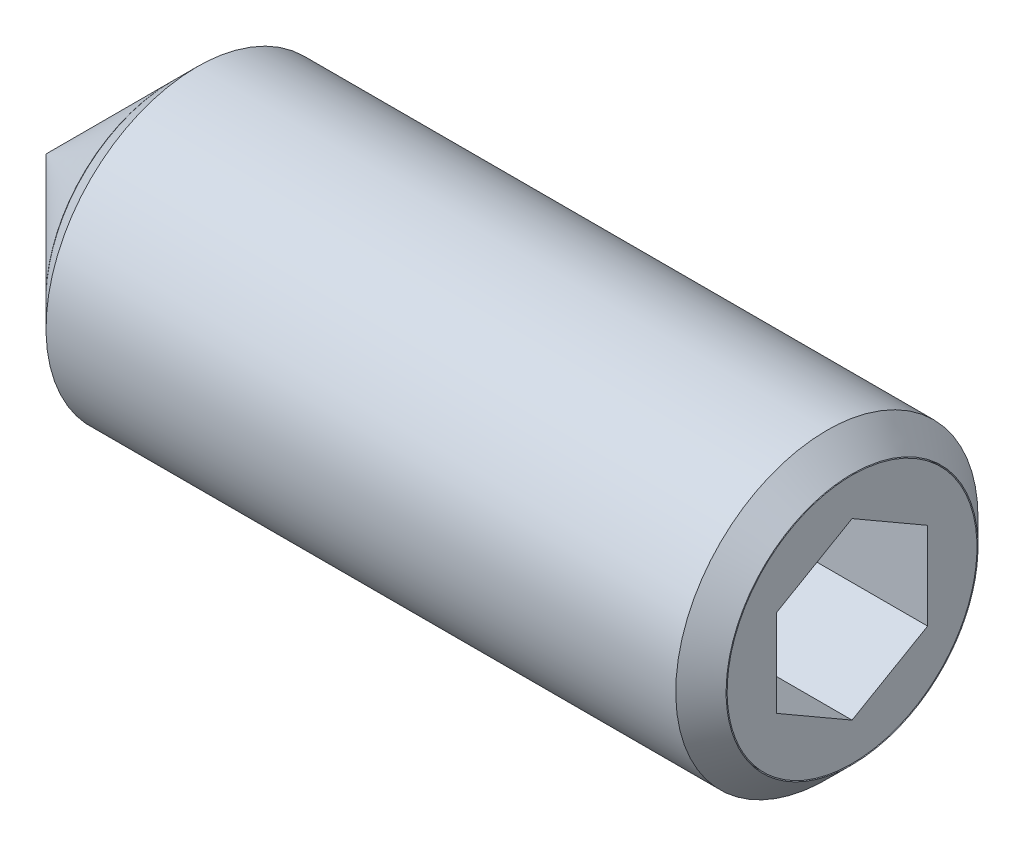
ISO-10303-21;
HEADER;
FILE_DESCRIPTION(('STEP AP214'),'2;1');
FILE_NAME('part.step','',(''),(''),'','','');
FILE_SCHEMA(('AUTOMOTIVE_DESIGN { 1 0 10303 214 1 1 1 1 }'));
ENDSEC;
DATA;
#1=APPLICATION_CONTEXT('core data for automotive mechanical design processes');
#2=APPLICATION_PROTOCOL_DEFINITION('international standard','automotive_design',2000,#1);
#3=PRODUCT_CONTEXT('',#1,'mechanical');
#4=PRODUCT('Part','Part','',(#3));
#5=PRODUCT_RELATED_PRODUCT_CATEGORY('part','',(#4));
#6=PRODUCT_DEFINITION_FORMATION('','',#4);
#7=PRODUCT_DEFINITION_CONTEXT('part definition',#1,'design');
#8=PRODUCT_DEFINITION('design','',#6,#7);
#9=PRODUCT_DEFINITION_SHAPE('','',#8);
#10=(LENGTH_UNIT() NAMED_UNIT(*) SI_UNIT(.MILLI.,.METRE.));
#11=(NAMED_UNIT(*) PLANE_ANGLE_UNIT() SI_UNIT($,.RADIAN.));
#12=(NAMED_UNIT(*) SI_UNIT($,.STERADIAN.) SOLID_ANGLE_UNIT());
#13=UNCERTAINTY_MEASURE_WITH_UNIT(LENGTH_MEASURE(1.E-05),#10,'distance_accuracy_value','');
#14=(GEOMETRIC_REPRESENTATION_CONTEXT(3) GLOBAL_UNCERTAINTY_ASSIGNED_CONTEXT((#13)) GLOBAL_UNIT_ASSIGNED_CONTEXT((#10,
#11,#12)) REPRESENTATION_CONTEXT('',''));
#15=CARTESIAN_POINT('',(0.,0.,0.));
#16=DIRECTION('',(0.,0.,1.));
#17=DIRECTION('',(1.,0.,0.));
#18=AXIS2_PLACEMENT_3D('',#15,#16,#17);
#19=CARTESIAN_POINT('',(22.947719387639,-7.76870930109512,-2.72800000001087));
#20=CARTESIAN_POINT('',(22.947719387639,-7.76870930109512,2.72800000001087));
#21=CARTESIAN_POINT('',(22.947719387639,-2.31270930107338,-2.72800000001087));
#22=CARTESIAN_POINT('',(22.947719387639,-2.31270930107338,2.72800000001087));
#23=(BOUNDED_SURFACE() B_SPLINE_SURFACE(1,1,((#19,#20),(#21,#22)),.UNSPECIFIED.,.F.,.F.,
.F.) B_SPLINE_SURFACE_WITH_KNOTS((2,2),(2,2),(0.,1.),(0.,1.),
.UNSPECIFIED.) GEOMETRIC_REPRESENTATION_ITEM() RATIONAL_B_SPLINE_SURFACE(((1.,1.),(1.,1.))) REPRESENTATION_ITEM('') SURFACE());
#24=CARTESIAN_POINT('',(22.947719387639,-3.30865849351534,0.));
#25=CARTESIAN_POINT('',(22.947719387639,-4.17468389729979,-1.50000000000004));
#26=(BOUNDED_CURVE() B_SPLINE_CURVE(1,(#24,#25),.UNSPECIFIED.,.F.,
.F.) B_SPLINE_CURVE_WITH_KNOTS((2,2),(0.,1.),
.UNSPECIFIED.) CURVE() GEOMETRIC_REPRESENTATION_ITEM() RATIONAL_B_SPLINE_CURVE((1.,1.)) REPRESENTATION_ITEM(''));
#27=CARTESIAN_POINT('',(22.947719387639,-3.30865849351538,0.));
#28=VERTEX_POINT('',#27);
#29=CARTESIAN_POINT('',(22.947719387639,-4.17468389729985,-1.5));
#30=VERTEX_POINT('',#29);
#31=EDGE_CURVE('P0_E100',#28,#30,#26,.T.);
#32=CARTESIAN_POINT('',(22.947719387639,-4.17468389729979,-1.50000000000004));
#33=CARTESIAN_POINT('',(22.947719387639,-5.90673470486864,-1.50000000000006));
#34=(BOUNDED_CURVE() B_SPLINE_CURVE(1,(#32,#33),.UNSPECIFIED.,.F.,
.F.) B_SPLINE_CURVE_WITH_KNOTS((2,2),(0.,1.),
.UNSPECIFIED.) CURVE() GEOMETRIC_REPRESENTATION_ITEM() RATIONAL_B_SPLINE_CURVE((1.,1.)) REPRESENTATION_ITEM(''));
#35=CARTESIAN_POINT('',(22.947719387639,-5.9067347048687,-1.5));
#36=VERTEX_POINT('',#35);
#37=EDGE_CURVE('P0_E388',#30,#36,#34,.T.);
#38=CARTESIAN_POINT('',(22.947719387639,-5.90673470486864,-1.50000000000006));
#39=CARTESIAN_POINT('',(22.947719387639,-6.77276010865311,0.));
#40=(BOUNDED_CURVE() B_SPLINE_CURVE(1,(#38,#39),.UNSPECIFIED.,.F.,
.F.) B_SPLINE_CURVE_WITH_KNOTS((2,2),(0.,1.),
.UNSPECIFIED.) CURVE() GEOMETRIC_REPRESENTATION_ITEM() RATIONAL_B_SPLINE_CURVE((1.,1.)) REPRESENTATION_ITEM(''));
#41=CARTESIAN_POINT('',(22.947719387639,-6.77276010865315,0.));
#42=VERTEX_POINT('',#41);
#43=EDGE_CURVE('P0_E412',#36,#42,#40,.T.);
#44=CARTESIAN_POINT('',(22.947719387639,-6.77276010865311,0.));
#45=CARTESIAN_POINT('',(22.947719387639,-5.90673470486868,1.5));
#46=(BOUNDED_CURVE() B_SPLINE_CURVE(1,(#44,#45),.UNSPECIFIED.,.F.,
.F.) B_SPLINE_CURVE_WITH_KNOTS((2,2),(0.,1.),
.UNSPECIFIED.) CURVE() GEOMETRIC_REPRESENTATION_ITEM() RATIONAL_B_SPLINE_CURVE((1.,1.)) REPRESENTATION_ITEM(''));
#47=CARTESIAN_POINT('',(22.947719387639,-5.90673470486872,1.50000000000003));
#48=VERTEX_POINT('',#47);
#49=EDGE_CURVE('P0_E426',#42,#48,#46,.T.);
#50=CARTESIAN_POINT('',(22.947719387639,-5.90673470486868,1.5));
#51=CARTESIAN_POINT('',(22.947719387639,-4.17468389729977,1.49999999999996));
#52=(BOUNDED_CURVE() B_SPLINE_CURVE(1,(#50,#51),.UNSPECIFIED.,.F.,
.F.) B_SPLINE_CURVE_WITH_KNOTS((2,2),(0.,1.),
.UNSPECIFIED.) CURVE() GEOMETRIC_REPRESENTATION_ITEM() RATIONAL_B_SPLINE_CURVE((1.,1.)) REPRESENTATION_ITEM(''));
#53=CARTESIAN_POINT('',(22.947719387639,-4.17468389729981,1.49999999999998));
#54=VERTEX_POINT('',#53);
#55=EDGE_CURVE('P0_E103',#48,#54,#52,.T.);
#56=CARTESIAN_POINT('',(22.947719387639,-4.17468389729977,1.49999999999996));
#57=CARTESIAN_POINT('',(22.947719387639,-3.30865849351534,0.));
#58=(BOUNDED_CURVE() B_SPLINE_CURVE(1,(#56,#57),.UNSPECIFIED.,.F.,
.F.) B_SPLINE_CURVE_WITH_KNOTS((2,2),(0.,1.),
.UNSPECIFIED.) CURVE() GEOMETRIC_REPRESENTATION_ITEM() RATIONAL_B_SPLINE_CURVE((1.,1.)) REPRESENTATION_ITEM(''));
#59=EDGE_CURVE('P0_E96',#54,#28,#58,.T.);
#60=CARTESIAN_POINT('',(22.947719387639,-2.56070930107437,0.));
#61=CARTESIAN_POINT('',(22.9477193876389,-2.56070930107437,-4.29548600278793));
#62=CARTESIAN_POINT('',(22.947719387639,-6.28070930108919,-2.14774300139397));
#63=CARTESIAN_POINT('',(22.9477193876389,-10.000709301104,0.));
#64=CARTESIAN_POINT('',(22.947719387639,-6.28070930108919,2.14774300139397));
#65=CARTESIAN_POINT('',(22.9477193876389,-2.56070930107436,4.29548600278793));
#66=CARTESIAN_POINT('',(22.947719387639,-2.56070930107437,0.));
#67=(BOUNDED_CURVE() B_SPLINE_CURVE(2,(#60,#61,#62,#63,#64,#65,#66),.UNSPECIFIED.,.T.,
.F.) B_SPLINE_CURVE_WITH_KNOTS((3,2,2,3),(0.,0.333333333333333,0.666666666666667,1.),
.UNSPECIFIED.) CURVE() GEOMETRIC_REPRESENTATION_ITEM() RATIONAL_B_SPLINE_CURVE((1.,0.5,1.,0.5,
1.,0.5,1.)) REPRESENTATION_ITEM(''));
#68=CARTESIAN_POINT('',(22.947719387639,-2.56070930107437,0.));
#69=VERTEX_POINT('',#68);
#70=EDGE_CURVE('P0_E11',#69,#69,#67,.T.);
#71=ORIENTED_EDGE('',*,*,#31,.T.);
#72=ORIENTED_EDGE('',*,*,#37,.T.);
#73=ORIENTED_EDGE('',*,*,#43,.T.);
#74=ORIENTED_EDGE('',*,*,#49,.T.);
#75=ORIENTED_EDGE('',*,*,#55,.T.);
#76=ORIENTED_EDGE('',*,*,#59,.T.);
#77=EDGE_LOOP('',(#71,#72,#73,#74,#75,#76));
#78=FACE_BOUND('',#77,.T.);
#79=ORIENTED_EDGE('',*,*,#70,.F.);
#80=EDGE_LOOP('',(#79));
#81=FACE_BOUND('',#80,.T.);
#82=ADVANCED_FACE('P0_F16',(#78,#81),#23,.T.);
#83=CARTESIAN_POINT('',(9.42771938764875,-2.56070930107437,0.));
#84=CARTESIAN_POINT('',(22.947719387639,-2.56070930107437,0.));
#85=CARTESIAN_POINT('',(9.42771938764876,-2.56070930107437,4.29548600278793));
#86=CARTESIAN_POINT('',(22.9477193876389,-2.56070930107436,4.29548600278793));
#87=CARTESIAN_POINT('',(9.42771938764875,-6.28070930108919,2.14774300139397));
#88=CARTESIAN_POINT('',(22.947719387639,-6.28070930108919,2.14774300139397));
#89=CARTESIAN_POINT('',(9.42771938764876,-10.000709301104,0.));
#90=CARTESIAN_POINT('',(22.9477193876389,-10.000709301104,0.));
#91=CARTESIAN_POINT('',(9.42771938764875,-6.28070930108919,-2.14774300139397));
#92=CARTESIAN_POINT('',(22.947719387639,-6.28070930108919,-2.14774300139397));
#93=CARTESIAN_POINT('',(9.42771938764876,-2.56070930107437,-4.29548600278793));
#94=CARTESIAN_POINT('',(22.9477193876389,-2.56070930107437,-4.29548600278793));
#95=CARTESIAN_POINT('',(9.42771938764875,-2.56070930107437,0.));
#96=CARTESIAN_POINT('',(22.947719387639,-2.56070930107437,0.));
#97=(BOUNDED_SURFACE() B_SPLINE_SURFACE(2,1,((#83,#84),(#85,#86),(#87,#88),(#89,#90),(#91,#92),
(#93,#94),(#95,#96)),.UNSPECIFIED.,.T.,.F.,.F.) B_SPLINE_SURFACE_WITH_KNOTS((3,2,2,3),(2,2),(0.,
0.333333333333333,0.666666666666667,1.),(0.,1.),
.UNSPECIFIED.) GEOMETRIC_REPRESENTATION_ITEM() RATIONAL_B_SPLINE_SURFACE(((1.,1.),(0.5,0.5),(1.,
1.),(0.5,0.5),(1.,1.),(0.5,0.5),(1.,1.))) REPRESENTATION_ITEM('') SURFACE());
#98=CARTESIAN_POINT('',(9.42771938764875,-2.56070930107437,0.));
#99=CARTESIAN_POINT('',(9.42771938764876,-2.56070930107437,4.29548600278793));
#100=CARTESIAN_POINT('',(9.42771938764875,-6.28070930108919,2.14774300139397));
#101=CARTESIAN_POINT('',(9.42771938764876,-10.000709301104,0.));
#102=CARTESIAN_POINT('',(9.42771938764875,-6.28070930108919,-2.14774300139397));
#103=CARTESIAN_POINT('',(9.42771938764876,-2.56070930107437,-4.29548600278793));
#104=CARTESIAN_POINT('',(9.42771938764875,-2.56070930107437,0.));
#105=(BOUNDED_CURVE() B_SPLINE_CURVE(2,(#98,#99,#100,#101,#102,#103,#104),.UNSPECIFIED.,.T.,
.F.) B_SPLINE_CURVE_WITH_KNOTS((3,2,2,3),(0.,0.333333333333333,0.666666666666667,1.),
.UNSPECIFIED.) CURVE() GEOMETRIC_REPRESENTATION_ITEM() RATIONAL_B_SPLINE_CURVE((1.,0.5,1.,0.5,
1.,0.5,1.)) REPRESENTATION_ITEM(''));
#106=CARTESIAN_POINT('',(9.42771938764875,-2.56070930107437,0.));
#107=VERTEX_POINT('',#106);
#108=EDGE_CURVE('P0_E161',#107,#107,#105,.T.);
#109=CARTESIAN_POINT('',(22.947719387639,-2.56070930107437,0.));
#110=CARTESIAN_POINT('',(9.42771938764875,-2.56070930107437,0.));
#111=(BOUNDED_CURVE() B_SPLINE_CURVE(1,(#109,#110),.UNSPECIFIED.,.F.,
.F.) B_SPLINE_CURVE_WITH_KNOTS((2,2),(0.,1.),
.UNSPECIFIED.) CURVE() GEOMETRIC_REPRESENTATION_ITEM() RATIONAL_B_SPLINE_CURVE((1.,1.)) REPRESENTATION_ITEM(''));
#112=EDGE_CURVE('P0_E29',#69,#107,#111,.T.);
#113=ORIENTED_EDGE('',*,*,#108,.T.);
#114=ORIENTED_EDGE('',*,*,#112,.F.);
#115=ORIENTED_EDGE('',*,*,#70,.T.);
#116=ORIENTED_EDGE('',*,*,#112,.T.);
#117=EDGE_LOOP('',(#113,#114,#115,#116));
#118=FACE_BOUND('',#117,.T.);
#119=ADVANCED_FACE('P0_F180',(#118),#97,.T.);
#120=CARTESIAN_POINT('',(6.94771938763892,-5.04070930108425,0.));
#121=CARTESIAN_POINT('',(9.42771938764875,-2.56070930107437,0.));
#122=CARTESIAN_POINT('',(6.94771938763892,-5.04070930108425,0.));
#123=CARTESIAN_POINT('',(9.42771938764876,-2.56070930107436,4.29548600278793));
#124=CARTESIAN_POINT('',(6.94771938763892,-5.04070930108425,0.));
#125=CARTESIAN_POINT('',(9.42771938764875,-6.28070930108919,2.14774300139397));
#126=CARTESIAN_POINT('',(6.94771938763892,-5.04070930108425,0.));
#127=CARTESIAN_POINT('',(9.42771938764876,-10.000709301104,0.));
#128=CARTESIAN_POINT('',(6.94771938763892,-5.04070930108425,0.));
#129=CARTESIAN_POINT('',(9.42771938764875,-6.28070930108919,-2.14774300139397));
#130=CARTESIAN_POINT('',(6.94771938763892,-5.04070930108425,0.));
#131=CARTESIAN_POINT('',(9.42771938764876,-2.56070930107437,-4.29548600278793));
#132=CARTESIAN_POINT('',(6.94771938763892,-5.04070930108425,0.));
#133=CARTESIAN_POINT('',(9.42771938764875,-2.56070930107437,0.));
#134=(BOUNDED_SURFACE() B_SPLINE_SURFACE(2,1,((#120,#121),(#122,#123),(#124,#125),(#126,#127),
(#128,#129),(#130,#131),(#132,#133)),.UNSPECIFIED.,.T.,.F.,.F.) B_SPLINE_SURFACE_WITH_KNOTS((3,
2,2,3),(2,2),(0.,0.333333333333333,0.666666666666667,1.),(0.,1.),
.UNSPECIFIED.) GEOMETRIC_REPRESENTATION_ITEM() RATIONAL_B_SPLINE_SURFACE(((1.,1.),(0.5,0.5),(1.,
1.),(0.5,0.5),(1.,1.),(0.5,0.5),(1.,1.))) REPRESENTATION_ITEM('') SURFACE());
#135=CARTESIAN_POINT('',(9.42771938764875,-2.56070930107437,0.));
#136=CARTESIAN_POINT('',(6.94771938763892,-5.04070930108425,0.));
#137=(BOUNDED_CURVE() B_SPLINE_CURVE(1,(#135,#136),.UNSPECIFIED.,.F.,
.F.) B_SPLINE_CURVE_WITH_KNOTS((2,2),(0.,1.),
.UNSPECIFIED.) CURVE() GEOMETRIC_REPRESENTATION_ITEM() RATIONAL_B_SPLINE_CURVE((1.,1.)) REPRESENTATION_ITEM(''));
#138=CARTESIAN_POINT('',(6.94771938763892,-5.04070930108425,0.));
#139=VERTEX_POINT('',#138);
#140=EDGE_CURVE('P0_E108',#107,#139,#137,.T.);
#141=ORIENTED_EDGE('',*,*,#140,.F.);
#142=ORIENTED_EDGE('',*,*,#108,.F.);
#143=ORIENTED_EDGE('',*,*,#140,.T.);
#144=EDGE_LOOP('',(#141,#142,#143));
#145=FACE_BOUND('',#144,.T.);
#146=ADVANCED_FACE('P0_F292',(#145),#134,.T.);
#147=CARTESIAN_POINT('',(22.947719387639,-4.17468389729981,1.49999999999998));
#148=CARTESIAN_POINT('',(18.3974080803244,-4.17468389729981,1.49999999999998));
#149=CARTESIAN_POINT('',(22.947719387639,-3.30865849351538,0.));
#150=CARTESIAN_POINT('',(18.3974080803244,-3.30865849351538,0.));
#151=(BOUNDED_SURFACE() B_SPLINE_SURFACE(1,1,((#147,#148),(#149,#150)),.UNSPECIFIED.,.F.,.F.,
.F.) B_SPLINE_SURFACE_WITH_KNOTS((2,2),(2,2),(0.,1.),(0.,1.),
.UNSPECIFIED.) GEOMETRIC_REPRESENTATION_ITEM() RATIONAL_B_SPLINE_SURFACE(((1.,1.),(1.,1.))) REPRESENTATION_ITEM('') SURFACE());
#152=CARTESIAN_POINT('',(22.947719387639,-3.30865849351534,0.));
#153=CARTESIAN_POINT('',(19.4477193876389,-3.30865849351534,0.));
#154=(BOUNDED_CURVE() B_SPLINE_CURVE(1,(#152,#153),.UNSPECIFIED.,.F.,
.F.) B_SPLINE_CURVE_WITH_KNOTS((2,2),(0.,0.769178142685269),
.UNSPECIFIED.) CURVE() GEOMETRIC_REPRESENTATION_ITEM() RATIONAL_B_SPLINE_CURVE((1.,1.)) REPRESENTATION_ITEM(''));
#155=CARTESIAN_POINT('',(19.4477193876389,-3.30865849351545,0.));
#156=VERTEX_POINT('',#155);
#157=EDGE_CURVE('P0_E112',#28,#156,#154,.T.);
#158=CARTESIAN_POINT('',(19.4477193876389,-4.17468389729977,1.49999999999996));
#159=CARTESIAN_POINT('',(22.947719387639,-4.17468389729977,1.49999999999996));
#160=(BOUNDED_CURVE() B_SPLINE_CURVE(1,(#158,#159),.UNSPECIFIED.,.F.,
.F.) B_SPLINE_CURVE_WITH_KNOTS((2,2),(0.230821857314735,1.),
.UNSPECIFIED.) CURVE() GEOMETRIC_REPRESENTATION_ITEM() RATIONAL_B_SPLINE_CURVE((1.,1.)) REPRESENTATION_ITEM(''));
#161=CARTESIAN_POINT('',(19.4477193876389,-4.17468389729981,1.49999999999999));
#162=VERTEX_POINT('',#161);
#163=EDGE_CURVE('P0_E442',#162,#54,#160,.T.);
#164=CARTESIAN_POINT('',(19.4477193876389,-3.30865849351541,1.301043E-13));
#165=CARTESIAN_POINT('',(19.1851415608104,-3.74167119540757,0.750000000000018));
#166=CARTESIAN_POINT('',(19.4477193876389,-4.17468389729973,1.4999999999999));
#167=(BOUNDED_CURVE() B_SPLINE_CURVE(2,(#164,#165,#166),.UNSPECIFIED.,.F.,
.F.) B_SPLINE_CURVE_WITH_KNOTS((3,3),(0.,1.),
.UNSPECIFIED.) CURVE() GEOMETRIC_REPRESENTATION_ITEM() RATIONAL_B_SPLINE_CURVE((1.,
1.15470053837919,1.)) REPRESENTATION_ITEM(''));
#168=EDGE_CURVE('P0_E109',#156,#162,#167,.T.);
#169=ORIENTED_EDGE('',*,*,#157,.F.);
#170=ORIENTED_EDGE('',*,*,#59,.F.);
#171=ORIENTED_EDGE('',*,*,#163,.F.);
#172=ORIENTED_EDGE('',*,*,#168,.F.);
#173=EDGE_LOOP('',(#169,#170,#171,#172));
#174=FACE_BOUND('',#173,.T.);
#175=ADVANCED_FACE('P0_F113',(#174),#151,.F.);
#176=CARTESIAN_POINT('',(18.3974080803244,-5.04070930108432,0.));
#177=CARTESIAN_POINT('',(19.4477193876389,-3.30865849351541,0.));
#178=CARTESIAN_POINT('',(18.3974080803244,-5.04070930108432,0.));
#179=CARTESIAN_POINT('',(19.4477193876389,-3.30865849351539,-3.00000000000005));
#180=CARTESIAN_POINT('',(18.3974080803244,-5.04070930108432,0.));
#181=CARTESIAN_POINT('',(19.447719387639,-5.90673470486873,-1.50000000000006));
#182=CARTESIAN_POINT('',(18.3974080803244,-5.04070930108432,0.));
#183=CARTESIAN_POINT('',(19.447719387639,-8.50481091622208,0.));
#184=CARTESIAN_POINT('',(18.3974080803244,-5.04070930108432,0.));
#185=CARTESIAN_POINT('',(19.447719387639,-5.90673470486875,1.49999999999997));
#186=CARTESIAN_POINT('',(18.3974080803244,-5.04070930108432,0.));
#187=CARTESIAN_POINT('',(19.4477193876389,-3.30865849351542,3.));
#188=CARTESIAN_POINT('',(18.3974080803244,-5.04070930108432,0.));
#189=CARTESIAN_POINT('',(19.4477193876389,-3.30865849351541,0.));
#190=(BOUNDED_SURFACE() B_SPLINE_SURFACE(2,1,((#176,#177),(#178,#179),(#180,#181),(#182,#183),
(#184,#185),(#186,#187),(#188,#189)),.UNSPECIFIED.,.T.,.F.,.F.) B_SPLINE_SURFACE_WITH_KNOTS((3,
2,2,3),(2,2),(0.,0.333333333333333,0.666666666666667,1.),(0.,1.),
.UNSPECIFIED.) GEOMETRIC_REPRESENTATION_ITEM() RATIONAL_B_SPLINE_SURFACE(((1.,1.),(0.5,0.5),(1.,
1.),(0.5,0.5),(1.,1.),(0.5,0.5),(1.,1.))) REPRESENTATION_ITEM('') SURFACE());
#191=CARTESIAN_POINT('',(19.4477193876389,-3.30865849351541,0.));
#192=CARTESIAN_POINT('',(18.3974080803244,-5.04070930108433,0.));
#193=(BOUNDED_CURVE() B_SPLINE_CURVE(1,(#191,#192),.UNSPECIFIED.,.F.,
.F.) B_SPLINE_CURVE_WITH_KNOTS((2,2),(0.,1.),
.UNSPECIFIED.) CURVE() GEOMETRIC_REPRESENTATION_ITEM() RATIONAL_B_SPLINE_CURVE((1.,1.)) REPRESENTATION_ITEM(''));
#194=CARTESIAN_POINT('',(18.3974080803244,-5.04070930108437,0.));
#195=VERTEX_POINT('',#194);
#196=EDGE_CURVE('P0_E146',#156,#195,#193,.T.);
#197=CARTESIAN_POINT('',(19.4477193876389,-4.17468389729984,1.49999999999996));
#198=CARTESIAN_POINT('',(19.1851415608104,-5.04070930108428,1.49999999999998));
#199=CARTESIAN_POINT('',(19.447719387639,-5.90673470486871,1.5));
#200=(BOUNDED_CURVE() B_SPLINE_CURVE(2,(#197,#198,#199),.UNSPECIFIED.,.F.,
.F.) B_SPLINE_CURVE_WITH_KNOTS((3,3),(0.,1.),
.UNSPECIFIED.) CURVE() GEOMETRIC_REPRESENTATION_ITEM() RATIONAL_B_SPLINE_CURVE((1.,
1.15470053837925,1.)) REPRESENTATION_ITEM(''));
#201=CARTESIAN_POINT('',(19.447719387639,-5.90673470486872,1.50000000000003));
#202=VERTEX_POINT('',#201);
#203=EDGE_CURVE('P0_E429',#162,#202,#200,.T.);
#204=CARTESIAN_POINT('',(19.447719387639,-5.90673470486866,1.5));
#205=CARTESIAN_POINT('',(19.1851415608103,-6.33974740676093,0.749999999999932));
#206=CARTESIAN_POINT('',(19.447719387639,-6.77276010865319,-1.543904E-13));
#207=(BOUNDED_CURVE() B_SPLINE_CURVE(2,(#204,#205,#206),.UNSPECIFIED.,.F.,
.F.) B_SPLINE_CURVE_WITH_KNOTS((3,3),(0.,1.),
.UNSPECIFIED.) CURVE() GEOMETRIC_REPRESENTATION_ITEM() RATIONAL_B_SPLINE_CURVE((1.,
1.1547005383793,1.)) REPRESENTATION_ITEM(''));
#208=CARTESIAN_POINT('',(19.447719387639,-6.77276010865315,0.));
#209=VERTEX_POINT('',#208);
#210=EDGE_CURVE('P0_E415',#202,#209,#207,.T.);
#211=CARTESIAN_POINT('',(19.447719387639,-6.77276010865319,1.387779E-13));
#212=CARTESIAN_POINT('',(19.1851415608102,-6.3397474067609,-0.749999999999997));
#213=CARTESIAN_POINT('',(19.4477193876389,-5.90673470486859,-1.50000000000014));
#214=(BOUNDED_CURVE() B_SPLINE_CURVE(2,(#211,#212,#213),.UNSPECIFIED.,.F.,
.F.) B_SPLINE_CURVE_WITH_KNOTS((3,3),(0.,1.),
.UNSPECIFIED.) CURVE() GEOMETRIC_REPRESENTATION_ITEM() RATIONAL_B_SPLINE_CURVE((1.,
1.15470053837932,1.)) REPRESENTATION_ITEM(''));
#215=CARTESIAN_POINT('',(19.447719387639,-5.9067347048687,-1.5));
#216=VERTEX_POINT('',#215);
#217=EDGE_CURVE('P0_E393',#209,#216,#214,.T.);
#218=CARTESIAN_POINT('',(19.447719387639,-5.90673470486874,-1.50000000000006));
#219=CARTESIAN_POINT('',(19.1851415608103,-5.0407093010843,-1.50000000000004));
#220=CARTESIAN_POINT('',(19.4477193876389,-4.17468389729984,-1.50000000000003));
#221=(BOUNDED_CURVE() B_SPLINE_CURVE(2,(#218,#219,#220),.UNSPECIFIED.,.F.,
.F.) B_SPLINE_CURVE_WITH_KNOTS((3,3),(0.,1.),
.UNSPECIFIED.) CURVE() GEOMETRIC_REPRESENTATION_ITEM() RATIONAL_B_SPLINE_CURVE((1.,
1.15470053837925,1.)) REPRESENTATION_ITEM(''));
#222=CARTESIAN_POINT('',(19.4477193876389,-4.17468389729985,-1.5));
#223=VERTEX_POINT('',#222);
#224=EDGE_CURVE('P0_E125',#216,#223,#221,.T.);
#225=CARTESIAN_POINT('',(19.4477193876389,-4.17468389729977,-1.5));
#226=CARTESIAN_POINT('',(19.1851415608103,-3.74167119540759,-0.750000000000068));
#227=CARTESIAN_POINT('',(19.4477193876389,-3.30865849351541,-1.387779E-13));
#228=(BOUNDED_CURVE() B_SPLINE_CURVE(2,(#225,#226,#227),.UNSPECIFIED.,.F.,
.F.) B_SPLINE_CURVE_WITH_KNOTS((3,3),(0.,1.),
.UNSPECIFIED.) CURVE() GEOMETRIC_REPRESENTATION_ITEM() RATIONAL_B_SPLINE_CURVE((1.,
1.15470053837921,1.)) REPRESENTATION_ITEM(''));
#229=EDGE_CURVE('P0_E118',#223,#156,#228,.T.);
#230=ORIENTED_EDGE('',*,*,#196,.T.);
#231=ORIENTED_EDGE('',*,*,#196,.F.);
#232=ORIENTED_EDGE('',*,*,#168,.T.);
#233=ORIENTED_EDGE('',*,*,#203,.T.);
#234=ORIENTED_EDGE('',*,*,#210,.T.);
#235=ORIENTED_EDGE('',*,*,#217,.T.);
#236=ORIENTED_EDGE('',*,*,#224,.T.);
#237=ORIENTED_EDGE('',*,*,#229,.T.);
#238=EDGE_LOOP('',(#230,#231,#232,#233,#234,#235,#236,#237));
#239=FACE_BOUND('',#238,.T.);
#240=ADVANCED_FACE('P0_F303',(#239),#190,.T.);
#241=CARTESIAN_POINT('',(22.947719387639,-3.30865849351538,0.));
#242=CARTESIAN_POINT('',(18.3974080803244,-3.30865849351538,0.));
#243=CARTESIAN_POINT('',(22.947719387639,-4.17468389729985,-1.5));
#244=CARTESIAN_POINT('',(18.3974080803244,-4.17468389729985,-1.5));
#245=(BOUNDED_SURFACE() B_SPLINE_SURFACE(1,1,((#241,#242),(#243,#244)),.UNSPECIFIED.,.F.,.F.,
.F.) B_SPLINE_SURFACE_WITH_KNOTS((2,2),(2,2),(0.,1.),(0.,1.),
.UNSPECIFIED.) GEOMETRIC_REPRESENTATION_ITEM() RATIONAL_B_SPLINE_SURFACE(((1.,1.),(1.,1.))) REPRESENTATION_ITEM('') SURFACE());
#246=CARTESIAN_POINT('',(19.4477193876389,-4.17468389729979,-1.50000000000004));
#247=CARTESIAN_POINT('',(22.947719387639,-4.17468389729979,-1.50000000000004));
#248=(BOUNDED_CURVE() B_SPLINE_CURVE(1,(#246,#247),.UNSPECIFIED.,.F.,
.F.) B_SPLINE_CURVE_WITH_KNOTS((2,2),(0.230821857314734,1.),
.UNSPECIFIED.) CURVE() GEOMETRIC_REPRESENTATION_ITEM() RATIONAL_B_SPLINE_CURVE((1.,1.)) REPRESENTATION_ITEM(''));
#249=EDGE_CURVE('P0_E122',#223,#30,#248,.T.);
#250=ORIENTED_EDGE('',*,*,#249,.T.);
#251=ORIENTED_EDGE('',*,*,#31,.F.);
#252=ORIENTED_EDGE('',*,*,#157,.T.);
#253=ORIENTED_EDGE('',*,*,#229,.F.);
#254=EDGE_LOOP('',(#250,#251,#252,#253));
#255=FACE_BOUND('',#254,.T.);
#256=ADVANCED_FACE('P0_F120',(#255),#245,.F.);
#257=CARTESIAN_POINT('',(22.947719387639,-4.17468389729985,-1.5));
#258=CARTESIAN_POINT('',(18.3974080803244,-4.17468389729985,-1.5));
#259=CARTESIAN_POINT('',(22.947719387639,-5.9067347048687,-1.5));
#260=CARTESIAN_POINT('',(18.3974080803244,-5.9067347048687,-1.5));
#261=(BOUNDED_SURFACE() B_SPLINE_SURFACE(1,1,((#257,#258),(#259,#260)),.UNSPECIFIED.,.F.,.F.,
.F.) B_SPLINE_SURFACE_WITH_KNOTS((2,2),(2,2),(0.,1.),(0.,1.),
.UNSPECIFIED.) GEOMETRIC_REPRESENTATION_ITEM() RATIONAL_B_SPLINE_SURFACE(((1.,1.),(1.,1.))) REPRESENTATION_ITEM('') SURFACE());
#262=CARTESIAN_POINT('',(19.447719387639,-5.90673470486864,-1.50000000000006));
#263=CARTESIAN_POINT('',(22.947719387639,-5.90673470486864,-1.50000000000006));
#264=(BOUNDED_CURVE() B_SPLINE_CURVE(1,(#262,#263),.UNSPECIFIED.,.F.,
.F.) B_SPLINE_CURVE_WITH_KNOTS((2,2),(0.230821857314741,1.),
.UNSPECIFIED.) CURVE() GEOMETRIC_REPRESENTATION_ITEM() RATIONAL_B_SPLINE_CURVE((1.,1.)) REPRESENTATION_ITEM(''));
#265=EDGE_CURVE('P0_E405',#216,#36,#264,.T.);
#266=ORIENTED_EDGE('',*,*,#265,.T.);
#267=ORIENTED_EDGE('',*,*,#37,.F.);
#268=ORIENTED_EDGE('',*,*,#249,.F.);
#269=ORIENTED_EDGE('',*,*,#224,.F.);
#270=EDGE_LOOP('',(#266,#267,#268,#269));
#271=FACE_BOUND('',#270,.T.);
#272=ADVANCED_FACE('P0_F316',(#271),#261,.F.);
#273=CARTESIAN_POINT('',(22.947719387639,-5.9067347048687,-1.5));
#274=CARTESIAN_POINT('',(18.3974080803244,-5.9067347048687,-1.5));
#275=CARTESIAN_POINT('',(22.947719387639,-6.77276010865315,0.));
#276=CARTESIAN_POINT('',(18.3974080803244,-6.77276010865315,0.));
#277=(BOUNDED_SURFACE() B_SPLINE_SURFACE(1,1,((#273,#274),(#275,#276)),.UNSPECIFIED.,.F.,.F.,
.F.) B_SPLINE_SURFACE_WITH_KNOTS((2,2),(2,2),(0.,1.),(0.,1.),
.UNSPECIFIED.) GEOMETRIC_REPRESENTATION_ITEM() RATIONAL_B_SPLINE_SURFACE(((1.,1.),(1.,1.))) REPRESENTATION_ITEM('') SURFACE());
#278=CARTESIAN_POINT('',(19.447719387639,-6.77276010865311,0.));
#279=CARTESIAN_POINT('',(22.947719387639,-6.77276010865311,0.));
#280=(BOUNDED_CURVE() B_SPLINE_CURVE(1,(#278,#279),.UNSPECIFIED.,.F.,
.F.) B_SPLINE_CURVE_WITH_KNOTS((2,2),(0.230821857314746,1.),
.UNSPECIFIED.) CURVE() GEOMETRIC_REPRESENTATION_ITEM() RATIONAL_B_SPLINE_CURVE((1.,1.)) REPRESENTATION_ITEM(''));
#281=EDGE_CURVE('P0_E422',#209,#42,#280,.T.);
#282=ORIENTED_EDGE('',*,*,#281,.T.);
#283=ORIENTED_EDGE('',*,*,#43,.F.);
#284=ORIENTED_EDGE('',*,*,#265,.F.);
#285=ORIENTED_EDGE('',*,*,#217,.F.);
#286=EDGE_LOOP('',(#282,#283,#284,#285));
#287=FACE_BOUND('',#286,.T.);
#288=ADVANCED_FACE('P0_F320',(#287),#277,.F.);
#289=CARTESIAN_POINT('',(22.947719387639,-6.77276010865315,0.));
#290=CARTESIAN_POINT('',(18.3974080803244,-6.77276010865315,0.));
#291=CARTESIAN_POINT('',(22.947719387639,-5.90673470486872,1.50000000000003));
#292=CARTESIAN_POINT('',(18.3974080803244,-5.90673470486872,1.50000000000003));
#293=(BOUNDED_SURFACE() B_SPLINE_SURFACE(1,1,((#289,#290),(#291,#292)),.UNSPECIFIED.,.F.,.F.,
.F.) B_SPLINE_SURFACE_WITH_KNOTS((2,2),(2,2),(0.,1.),(0.,1.),
.UNSPECIFIED.) GEOMETRIC_REPRESENTATION_ITEM() RATIONAL_B_SPLINE_SURFACE(((1.,1.),(1.,1.))) REPRESENTATION_ITEM('') SURFACE());
#294=CARTESIAN_POINT('',(19.447719387639,-5.90673470486868,1.5));
#295=CARTESIAN_POINT('',(22.947719387639,-5.90673470486868,1.5));
#296=(BOUNDED_CURVE() B_SPLINE_CURVE(1,(#294,#295),.UNSPECIFIED.,.F.,
.F.) B_SPLINE_CURVE_WITH_KNOTS((2,2),(0.230821857314743,1.),
.UNSPECIFIED.) CURVE() GEOMETRIC_REPRESENTATION_ITEM() RATIONAL_B_SPLINE_CURVE((1.,1.)) REPRESENTATION_ITEM(''));
#297=EDGE_CURVE('P0_E433',#202,#48,#296,.T.);
#298=ORIENTED_EDGE('',*,*,#297,.T.);
#299=ORIENTED_EDGE('',*,*,#49,.F.);
#300=ORIENTED_EDGE('',*,*,#281,.F.);
#301=ORIENTED_EDGE('',*,*,#210,.F.);
#302=EDGE_LOOP('',(#298,#299,#300,#301));
#303=FACE_BOUND('',#302,.T.);
#304=ADVANCED_FACE('P0_F329',(#303),#293,.F.);
#305=CARTESIAN_POINT('',(22.947719387639,-5.90673470486872,1.50000000000003));
#306=CARTESIAN_POINT('',(18.3974080803244,-5.90673470486872,1.50000000000003));
#307=CARTESIAN_POINT('',(22.947719387639,-4.17468389729981,1.49999999999998));
#308=CARTESIAN_POINT('',(18.3974080803244,-4.17468389729981,1.49999999999998));
#309=(BOUNDED_SURFACE() B_SPLINE_SURFACE(1,1,((#305,#306),(#307,#308)),.UNSPECIFIED.,.F.,.F.,
.F.) B_SPLINE_SURFACE_WITH_KNOTS((2,2),(2,2),(0.,1.),(0.,1.),
.UNSPECIFIED.) GEOMETRIC_REPRESENTATION_ITEM() RATIONAL_B_SPLINE_SURFACE(((1.,1.),(1.,1.))) REPRESENTATION_ITEM('') SURFACE());
#310=ORIENTED_EDGE('',*,*,#163,.T.);
#311=ORIENTED_EDGE('',*,*,#55,.F.);
#312=ORIENTED_EDGE('',*,*,#297,.F.);
#313=ORIENTED_EDGE('',*,*,#203,.F.);
#314=EDGE_LOOP('',(#310,#311,#312,#313));
#315=FACE_BOUND('',#314,.T.);
#316=ADVANCED_FACE('P0_F345',(#315),#309,.F.);
#317=CLOSED_SHELL('',(#82,#119,#146,#175,#240,#256,#272,#288,#304,#316));
#318=MANIFOLD_SOLID_BREP('P0_B1',#317);
#319=CARTESIAN_POINT('',(9.9477193876528,-2.0407093010703,0.));
#320=CARTESIAN_POINT('',(22.4477193876348,-2.04070930107023,0.));
#321=CARTESIAN_POINT('',(9.9477193876528,-2.0407093010703,5.19615242273078));
#322=CARTESIAN_POINT('',(22.4477193876348,-2.04070930107023,5.19615242273091));
#323=CARTESIAN_POINT('',(9.9477193876528,-6.54070930109122,2.59807621136539));
#324=CARTESIAN_POINT('',(22.4477193876348,-6.54070930109126,2.59807621136546));
#325=CARTESIAN_POINT('',(9.9477193876528,-11.0407093011121,0.));
#326=CARTESIAN_POINT('',(22.4477193876348,-11.0407093011123,0.));
#327=CARTESIAN_POINT('',(9.9477193876528,-6.54070930109122,-2.59807621136539));
#328=CARTESIAN_POINT('',(22.4477193876348,-6.54070930109126,-2.59807621136546));
#329=CARTESIAN_POINT('',(9.9477193876528,-2.04070930107031,-5.19615242273078));
#330=CARTESIAN_POINT('',(22.4477193876348,-2.04070930107023,-5.19615242273092));
#331=CARTESIAN_POINT('',(9.9477193876528,-2.0407093010703,0.));
#332=CARTESIAN_POINT('',(22.4477193876348,-2.04070930107023,0.));
#333=(BOUNDED_SURFACE() B_SPLINE_SURFACE(2,1,((#319,#320),(#321,#322),(#323,#324),(#325,#326),
(#327,#328),(#329,#330),(#331,#332)),.UNSPECIFIED.,.T.,.F.,.F.) B_SPLINE_SURFACE_WITH_KNOTS((3,
2,2,3),(2,2),(0.,0.333333333333333,0.666666666666667,1.),(0.,1.),
.UNSPECIFIED.) GEOMETRIC_REPRESENTATION_ITEM() RATIONAL_B_SPLINE_SURFACE(((1.,1.),(0.5,0.5),(1.,
1.),(0.5,0.5),(1.,1.),(0.5,0.5),(1.,1.))) REPRESENTATION_ITEM('') SURFACE());
#334=CARTESIAN_POINT('',(9.9477193876528,-2.0407093010703,0.));
#335=CARTESIAN_POINT('',(9.9477193876528,-2.0407093010703,5.19615242273078));
#336=CARTESIAN_POINT('',(9.9477193876528,-6.54070930109122,2.59807621136539));
#337=CARTESIAN_POINT('',(9.9477193876528,-11.0407093011121,0.));
#338=CARTESIAN_POINT('',(9.9477193876528,-6.54070930109122,-2.59807621136539));
#339=CARTESIAN_POINT('',(9.9477193876528,-2.04070930107031,-5.19615242273078));
#340=CARTESIAN_POINT('',(9.9477193876528,-2.0407093010703,0.));
#341=(BOUNDED_CURVE() B_SPLINE_CURVE(2,(#334,#335,#336,#337,#338,#339,#340),.UNSPECIFIED.,.T.,
.F.) B_SPLINE_CURVE_WITH_KNOTS((3,2,2,3),(0.,0.333333333333333,0.666666666666667,1.),
.UNSPECIFIED.) CURVE() GEOMETRIC_REPRESENTATION_ITEM() RATIONAL_B_SPLINE_CURVE((1.,0.5,1.,0.5,
1.,0.5,1.)) REPRESENTATION_ITEM(''));
#342=CARTESIAN_POINT('',(9.9477193876528,-2.0407093010703,0.));
#343=VERTEX_POINT('',#342);
#344=EDGE_CURVE('P1_E28',#343,#343,#341,.T.);
#345=CARTESIAN_POINT('',(22.4477193876348,-2.04070930107023,0.));
#346=CARTESIAN_POINT('',(9.9477193876528,-2.0407093010703,0.));
#347=(BOUNDED_CURVE() B_SPLINE_CURVE(1,(#345,#346),.UNSPECIFIED.,.F.,
.F.) B_SPLINE_CURVE_WITH_KNOTS((2,2),(0.,1.),
.UNSPECIFIED.) CURVE() GEOMETRIC_REPRESENTATION_ITEM() RATIONAL_B_SPLINE_CURVE((1.,1.)) REPRESENTATION_ITEM(''));
#348=CARTESIAN_POINT('',(22.4477193876348,-2.04070930107023,0.));
#349=VERTEX_POINT('',#348);
#350=EDGE_CURVE('P1_E11',#349,#343,#347,.T.);
#351=CARTESIAN_POINT('',(22.4477193876348,-2.04070930107023,0.));
#352=CARTESIAN_POINT('',(22.4477193876348,-2.04070930107023,5.19615242273091));
#353=CARTESIAN_POINT('',(22.4477193876348,-6.54070930109126,2.59807621136546));
#354=CARTESIAN_POINT('',(22.4477193876348,-11.0407093011123,0.));
#355=CARTESIAN_POINT('',(22.4477193876348,-6.54070930109126,-2.59807621136546));
#356=CARTESIAN_POINT('',(22.4477193876348,-2.04070930107023,-5.19615242273092));
#357=CARTESIAN_POINT('',(22.4477193876348,-2.04070930107023,0.));
#358=(BOUNDED_CURVE() B_SPLINE_CURVE(2,(#351,#352,#353,#354,#355,#356,#357),.UNSPECIFIED.,.T.,
.F.) B_SPLINE_CURVE_WITH_KNOTS((3,2,2,3),(0.,0.333333333333333,0.666666666666667,1.),
.UNSPECIFIED.) CURVE() GEOMETRIC_REPRESENTATION_ITEM() RATIONAL_B_SPLINE_CURVE((1.,0.5,1.,0.5,
1.,0.5,1.)) REPRESENTATION_ITEM(''));
#359=EDGE_CURVE('P1_E60',#349,#349,#358,.T.);
#360=ORIENTED_EDGE('',*,*,#344,.T.);
#361=ORIENTED_EDGE('',*,*,#350,.F.);
#362=ORIENTED_EDGE('',*,*,#359,.F.);
#363=ORIENTED_EDGE('',*,*,#350,.T.);
#364=EDGE_LOOP('',(#360,#361,#362,#363));
#365=FACE_BOUND('',#364,.T.);
#366=ADVANCED_FACE('P1_F16',(#365),#333,.T.);
#367=CARTESIAN_POINT('',(9.44771938764881,-2.54070930107431,0.));
#368=CARTESIAN_POINT('',(9.9477193876528,-2.0407093010703,0.));
#369=CARTESIAN_POINT('',(9.44771938764882,-2.5407093010743,4.33012701893942));
#370=CARTESIAN_POINT('',(9.9477193876528,-2.0407093010703,5.19615242273078));
#371=CARTESIAN_POINT('',(9.44771938764881,-6.29070930108922,2.16506350946971));
#372=CARTESIAN_POINT('',(9.9477193876528,-6.54070930109122,2.59807621136539));
#373=CARTESIAN_POINT('',(9.44771938764882,-10.0407093011041,0.));
#374=CARTESIAN_POINT('',(9.9477193876528,-11.0407093011121,0.));
#375=CARTESIAN_POINT('',(9.44771938764881,-6.29070930108922,-2.16506350946971));
#376=CARTESIAN_POINT('',(9.9477193876528,-6.54070930109122,-2.59807621136539));
#377=CARTESIAN_POINT('',(9.44771938764882,-2.54070930107431,-4.33012701893942));
#378=CARTESIAN_POINT('',(9.9477193876528,-2.04070930107031,-5.19615242273078));
#379=CARTESIAN_POINT('',(9.44771938764881,-2.54070930107431,0.));
#380=CARTESIAN_POINT('',(9.9477193876528,-2.0407093010703,0.));
#381=(BOUNDED_SURFACE() B_SPLINE_SURFACE(2,1,((#367,#368),(#369,#370),(#371,#372),(#373,#374),
(#375,#376),(#377,#378),(#379,#380)),.UNSPECIFIED.,.T.,.F.,.F.) B_SPLINE_SURFACE_WITH_KNOTS((3,
2,2,3),(2,2),(0.,0.333333333333333,0.666666666666667,1.),(0.,1.),
.UNSPECIFIED.) GEOMETRIC_REPRESENTATION_ITEM() RATIONAL_B_SPLINE_SURFACE(((1.,1.),(0.5,0.5),(1.,
1.),(0.5,0.5),(1.,1.),(0.5,0.5),(1.,1.))) REPRESENTATION_ITEM('') SURFACE());
#382=CARTESIAN_POINT('',(9.44771938764881,-2.54070930107431,0.));
#383=CARTESIAN_POINT('',(9.44771938764882,-2.5407093010743,4.33012701893942));
#384=CARTESIAN_POINT('',(9.44771938764881,-6.29070930108922,2.16506350946971));
#385=CARTESIAN_POINT('',(9.44771938764882,-10.0407093011041,0.));
#386=CARTESIAN_POINT('',(9.44771938764881,-6.29070930108922,-2.16506350946971));
#387=CARTESIAN_POINT('',(9.44771938764882,-2.54070930107431,-4.33012701893942));
#388=CARTESIAN_POINT('',(9.44771938764881,-2.54070930107431,0.));
#389=(BOUNDED_CURVE() B_SPLINE_CURVE(2,(#382,#383,#384,#385,#386,#387,#388),.UNSPECIFIED.,.T.,
.F.) B_SPLINE_CURVE_WITH_KNOTS((3,2,2,3),(0.,0.333333333333333,0.666666666666667,1.),
.UNSPECIFIED.) CURVE() GEOMETRIC_REPRESENTATION_ITEM() RATIONAL_B_SPLINE_CURVE((1.,0.5,1.,0.5,
1.,0.5,1.)) REPRESENTATION_ITEM(''));
#390=CARTESIAN_POINT('',(9.44771938764882,-2.54070930107431,0.));
#391=VERTEX_POINT('',#390);
#392=EDGE_CURVE('P1_E94',#391,#391,#389,.T.);
#393=CARTESIAN_POINT('',(9.9477193876528,-2.0407093010703,0.));
#394=CARTESIAN_POINT('',(9.44771938764881,-2.54070930107431,0.));
#395=(BOUNDED_CURVE() B_SPLINE_CURVE(1,(#393,#394),.UNSPECIFIED.,.F.,
.F.) B_SPLINE_CURVE_WITH_KNOTS((2,2),(0.,1.),
.UNSPECIFIED.) CURVE() GEOMETRIC_REPRESENTATION_ITEM() RATIONAL_B_SPLINE_CURVE((1.,1.)) REPRESENTATION_ITEM(''));
#396=EDGE_CURVE('P1_E49',#343,#391,#395,.T.);
#397=ORIENTED_EDGE('',*,*,#392,.T.);
#398=ORIENTED_EDGE('',*,*,#396,.F.);
#399=ORIENTED_EDGE('',*,*,#344,.F.);
#400=ORIENTED_EDGE('',*,*,#396,.T.);
#401=EDGE_LOOP('',(#397,#398,#399,#400));
#402=FACE_BOUND('',#401,.T.);
#403=ADVANCED_FACE('P1_F144',(#402),#381,.T.);
#404=CARTESIAN_POINT('',(22.947719387639,-2.54070930107435,0.));
#405=CARTESIAN_POINT('',(9.44771938764882,-2.54070930107431,0.));
#406=CARTESIAN_POINT('',(22.9477193876389,-2.54070930107435,4.33012701893934));
#407=CARTESIAN_POINT('',(9.44771938764882,-2.54070930107431,4.33012701893941));
#408=CARTESIAN_POINT('',(22.947719387639,-6.2907093010892,2.16506350946967));
#409=CARTESIAN_POINT('',(9.44771938764882,-6.29070930108922,2.1650635094697));
#410=CARTESIAN_POINT('',(22.9477193876389,-10.040709301104,0.));
#411=CARTESIAN_POINT('',(9.44771938764882,-10.0407093011041,0.));
#412=CARTESIAN_POINT('',(22.947719387639,-6.2907093010892,-2.16506350946967));
#413=CARTESIAN_POINT('',(9.44771938764882,-6.29070930108922,-2.1650635094697));
#414=CARTESIAN_POINT('',(22.9477193876389,-2.54070930107435,-4.33012701893934));
#415=CARTESIAN_POINT('',(9.44771938764882,-2.54070930107431,-4.33012701893941));
#416=CARTESIAN_POINT('',(22.947719387639,-2.54070930107435,0.));
#417=CARTESIAN_POINT('',(9.44771938764882,-2.54070930107431,0.));
#418=(BOUNDED_SURFACE() B_SPLINE_SURFACE(2,1,((#404,#405),(#406,#407),(#408,#409),(#410,#411),
(#412,#413),(#414,#415),(#416,#417)),.UNSPECIFIED.,.T.,.F.,.F.) B_SPLINE_SURFACE_WITH_KNOTS((3,
2,2,3),(2,2),(0.,0.333333333333333,0.666666666666667,1.),(0.,1.),
.UNSPECIFIED.) GEOMETRIC_REPRESENTATION_ITEM() RATIONAL_B_SPLINE_SURFACE(((1.,1.),(0.5,0.5),(1.,
1.),(0.5,0.5),(1.,1.),(0.5,0.5),(1.,1.))) REPRESENTATION_ITEM('') SURFACE());
#419=CARTESIAN_POINT('',(22.947719387639,-2.54070930107435,0.));
#420=CARTESIAN_POINT('',(22.9477193876389,-2.54070930107435,-4.33012701893934));
#421=CARTESIAN_POINT('',(22.947719387639,-6.2907093010892,-2.16506350946967));
#422=CARTESIAN_POINT('',(22.9477193876389,-10.040709301104,0.));
#423=CARTESIAN_POINT('',(22.947719387639,-6.2907093010892,2.16506350946967));
#424=CARTESIAN_POINT('',(22.9477193876389,-2.54070930107435,4.33012701893934));
#425=CARTESIAN_POINT('',(22.947719387639,-2.54070930107435,0.));
#426=(BOUNDED_CURVE() B_SPLINE_CURVE(2,(#419,#420,#421,#422,#423,#424,#425),.UNSPECIFIED.,.T.,
.F.) B_SPLINE_CURVE_WITH_KNOTS((3,2,2,3),(0.,0.333333333333333,0.666666666666667,1.),
.UNSPECIFIED.) CURVE() GEOMETRIC_REPRESENTATION_ITEM() RATIONAL_B_SPLINE_CURVE((1.,0.5,1.,0.5,
1.,0.5,1.)) REPRESENTATION_ITEM(''));
#427=CARTESIAN_POINT('',(22.947719387639,-2.54070930107435,0.));
#428=VERTEX_POINT('',#427);
#429=EDGE_CURVE('P1_E67',#428,#428,#426,.T.);
#430=CARTESIAN_POINT('',(9.44771938764882,-2.54070930107431,0.));
#431=CARTESIAN_POINT('',(22.947719387639,-2.54070930107435,0.));
#432=(BOUNDED_CURVE() B_SPLINE_CURVE(1,(#430,#431),.UNSPECIFIED.,.F.,
.F.) B_SPLINE_CURVE_WITH_KNOTS((2,2),(0.,1.),
.UNSPECIFIED.) CURVE() GEOMETRIC_REPRESENTATION_ITEM() RATIONAL_B_SPLINE_CURVE((1.,1.)) REPRESENTATION_ITEM(''));
#433=EDGE_CURVE('P1_E74',#391,#428,#432,.T.);
#434=ORIENTED_EDGE('',*,*,#429,.F.);
#435=ORIENTED_EDGE('',*,*,#433,.F.);
#436=ORIENTED_EDGE('',*,*,#392,.F.);
#437=ORIENTED_EDGE('',*,*,#433,.T.);
#438=EDGE_LOOP('',(#434,#435,#436,#437));
#439=FACE_BOUND('',#438,.T.);
#440=ADVANCED_FACE('P1_F134',(#439),#418,.T.);
#441=CARTESIAN_POINT('',(22.4477193876348,-2.04070930107023,0.));
#442=CARTESIAN_POINT('',(22.947719387639,-2.54070930107435,0.));
#443=CARTESIAN_POINT('',(22.4477193876348,-2.04070930107023,5.19615242273091));
#444=CARTESIAN_POINT('',(22.9477193876389,-2.54070930107435,4.33012701893934));
#445=CARTESIAN_POINT('',(22.4477193876348,-6.54070930109126,2.59807621136546));
#446=CARTESIAN_POINT('',(22.947719387639,-6.2907093010892,2.16506350946967));
#447=CARTESIAN_POINT('',(22.4477193876348,-11.0407093011123,0.));
#448=CARTESIAN_POINT('',(22.9477193876389,-10.040709301104,0.));
#449=CARTESIAN_POINT('',(22.4477193876348,-6.54070930109126,-2.59807621136546));
#450=CARTESIAN_POINT('',(22.947719387639,-6.2907093010892,-2.16506350946967));
#451=CARTESIAN_POINT('',(22.4477193876348,-2.04070930107023,-5.19615242273092));
#452=CARTESIAN_POINT('',(22.9477193876389,-2.54070930107435,-4.33012701893934));
#453=CARTESIAN_POINT('',(22.4477193876348,-2.04070930107023,0.));
#454=CARTESIAN_POINT('',(22.947719387639,-2.54070930107435,0.));
#455=(BOUNDED_SURFACE() B_SPLINE_SURFACE(2,1,((#441,#442),(#443,#444),(#445,#446),(#447,#448),
(#449,#450),(#451,#452),(#453,#454)),.UNSPECIFIED.,.T.,.F.,.F.) B_SPLINE_SURFACE_WITH_KNOTS((3,
2,2,3),(2,2),(0.,0.333333333333333,0.666666666666667,1.),(0.,1.),
.UNSPECIFIED.) GEOMETRIC_REPRESENTATION_ITEM() RATIONAL_B_SPLINE_SURFACE(((1.,1.),(0.5,0.5),(1.,
1.),(0.5,0.5),(1.,1.),(0.5,0.5),(1.,1.))) REPRESENTATION_ITEM('') SURFACE());
#456=CARTESIAN_POINT('',(22.947719387639,-2.54070930107435,0.));
#457=CARTESIAN_POINT('',(22.4477193876348,-2.04070930107023,0.));
#458=(BOUNDED_CURVE() B_SPLINE_CURVE(1,(#456,#457),.UNSPECIFIED.,.F.,
.F.) B_SPLINE_CURVE_WITH_KNOTS((2,2),(0.,1.),
.UNSPECIFIED.) CURVE() GEOMETRIC_REPRESENTATION_ITEM() RATIONAL_B_SPLINE_CURVE((1.,1.)) REPRESENTATION_ITEM(''));
#459=EDGE_CURVE('P1_E64',#428,#349,#458,.T.);
#460=ORIENTED_EDGE('',*,*,#359,.T.);
#461=ORIENTED_EDGE('',*,*,#459,.F.);
#462=ORIENTED_EDGE('',*,*,#429,.T.);
#463=ORIENTED_EDGE('',*,*,#459,.T.);
#464=EDGE_LOOP('',(#460,#461,#462,#463));
#465=FACE_BOUND('',#464,.T.);
#466=ADVANCED_FACE('P1_F65',(#465),#455,.T.);
#467=CLOSED_SHELL('',(#366,#403,#440,#466));
#468=MANIFOLD_SOLID_BREP('P1_B1',#467);
#469=ADVANCED_BREP_SHAPE_REPRESENTATION('',(#18,#318,#468),#14);
#470=SHAPE_DEFINITION_REPRESENTATION(#9,#469);
ENDSEC;
END-ISO-10303-21;
